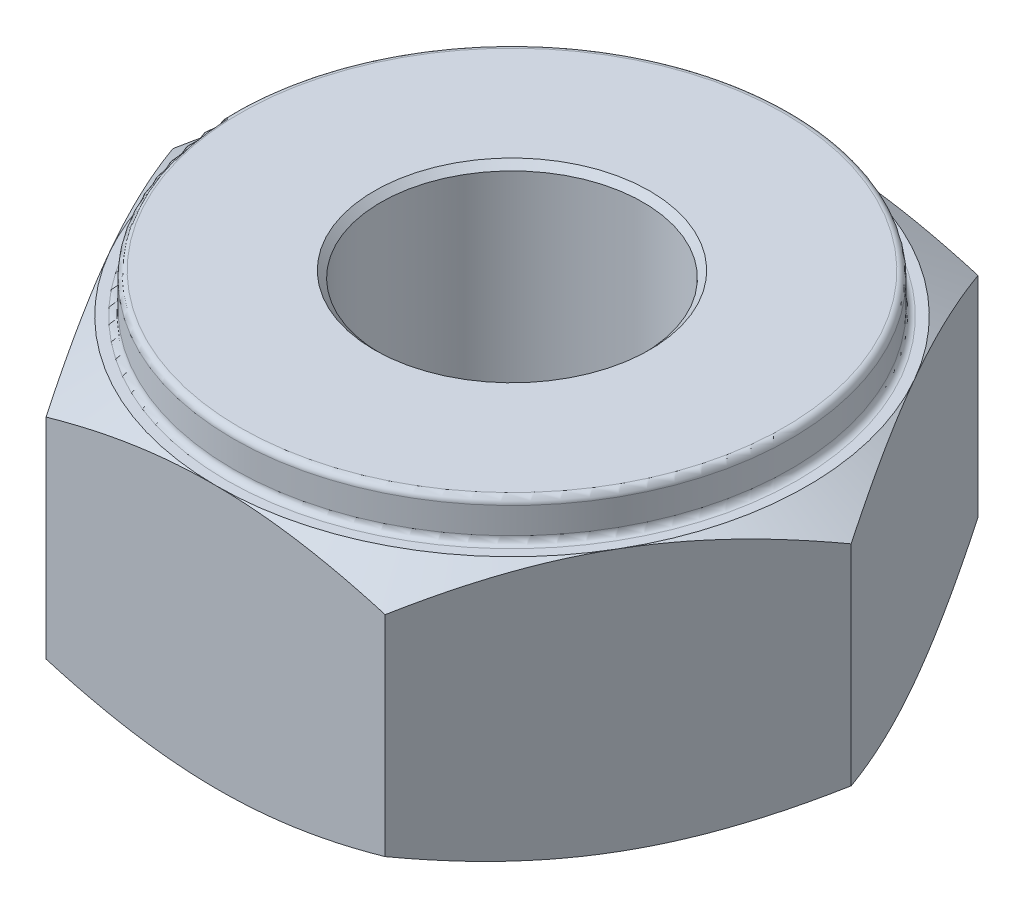
ISO-10303-21;
HEADER;
FILE_DESCRIPTION(('STEP AP214'),'2;1');
FILE_NAME('part.step','',(''),(''),'','','');
FILE_SCHEMA(('AUTOMOTIVE_DESIGN { 1 0 10303 214 1 1 1 1 }'));
ENDSEC;
DATA;
#1=APPLICATION_CONTEXT('core data for automotive mechanical design processes');
#2=APPLICATION_PROTOCOL_DEFINITION('international standard','automotive_design',2000,#1);
#3=PRODUCT_CONTEXT('',#1,'mechanical');
#4=PRODUCT('Part','Part','',(#3));
#5=PRODUCT_RELATED_PRODUCT_CATEGORY('part','',(#4));
#6=PRODUCT_DEFINITION_FORMATION('','',#4);
#7=PRODUCT_DEFINITION_CONTEXT('part definition',#1,'design');
#8=PRODUCT_DEFINITION('design','',#6,#7);
#9=PRODUCT_DEFINITION_SHAPE('','',#8);
#10=(LENGTH_UNIT() NAMED_UNIT(*) SI_UNIT(.MILLI.,.METRE.));
#11=(NAMED_UNIT(*) PLANE_ANGLE_UNIT() SI_UNIT($,.RADIAN.));
#12=(NAMED_UNIT(*) SI_UNIT($,.STERADIAN.) SOLID_ANGLE_UNIT());
#13=UNCERTAINTY_MEASURE_WITH_UNIT(LENGTH_MEASURE(1.E-05),#10,'distance_accuracy_value','');
#14=(GEOMETRIC_REPRESENTATION_CONTEXT(3) GLOBAL_UNCERTAINTY_ASSIGNED_CONTEXT((#13)) GLOBAL_UNIT_ASSIGNED_CONTEXT((#10,
#11,#12)) REPRESENTATION_CONTEXT('',''));
#15=CARTESIAN_POINT('',(0.,0.,0.));
#16=DIRECTION('',(0.,0.,1.));
#17=DIRECTION('',(1.,0.,0.));
#18=AXIS2_PLACEMENT_3D('',#15,#16,#17);
#19=CARTESIAN_POINT('',(0.,2.,0.));
#20=DIRECTION('',(0.,1.,0.));
#21=DIRECTION('',(0.,0.,1.));
#22=AXIS2_PLACEMENT_3D('',#19,#20,#21);
#23=PLANE('',#22);
#24=CARTESIAN_POINT('',(0.,2.,0.));
#25=DIRECTION('',(0.,1.,0.));
#26=DIRECTION('',(0.,0.,1.));
#27=AXIS2_PLACEMENT_3D('',#24,#25,#26);
#28=CIRCLE('',#27,2.175);
#29=CARTESIAN_POINT('',(0.,2.,2.175));
#30=VERTEX_POINT('',#29);
#31=EDGE_CURVE('E359',#30,#30,#28,.F.);
#32=ORIENTED_EDGE('',*,*,#31,.T.);
#33=EDGE_LOOP('',(#32));
#34=FACE_BOUND('',#33,.T.);
#35=CARTESIAN_POINT('',(0.,2.,0.));
#36=DIRECTION('',(0.,1.,0.));
#37=DIRECTION('',(0.,0.,1.));
#38=AXIS2_PLACEMENT_3D('',#35,#36,#37);
#39=CIRCLE('',#38,2.25);
#40=CARTESIAN_POINT('',(-0.0102695018015279,2.,2.24997656372966));
#41=VERTEX_POINT('',#40);
#42=CARTESIAN_POINT('',(1.94340211120874,2.,1.13388193130917));
#43=VERTEX_POINT('',#42);
#44=EDGE_CURVE('E274',#41,#43,#39,.T.);
#45=ORIENTED_EDGE('',*,*,#44,.T.);
#46=CARTESIAN_POINT('',(1.95367161301027,2.,-1.1160946324205));
#47=VERTEX_POINT('',#46);
#48=EDGE_CURVE('E271',#43,#47,#39,.T.);
#49=ORIENTED_EDGE('',*,*,#48,.T.);
#50=CARTESIAN_POINT('',(0.0102695018015286,2.,-2.24997656372966));
#51=VERTEX_POINT('',#50);
#52=EDGE_CURVE('E273',#47,#51,#39,.T.);
#53=ORIENTED_EDGE('',*,*,#52,.T.);
#54=CARTESIAN_POINT('',(-1.94340211120874,2.,-1.13388193130917));
#55=VERTEX_POINT('',#54);
#56=EDGE_CURVE('E280',#51,#55,#39,.T.);
#57=ORIENTED_EDGE('',*,*,#56,.T.);
#58=CARTESIAN_POINT('',(-1.95367161301027,2.,1.1160946324205));
#59=VERTEX_POINT('',#58);
#60=EDGE_CURVE('E283',#55,#59,#39,.T.);
#61=ORIENTED_EDGE('',*,*,#60,.T.);
#62=EDGE_CURVE('E281',#59,#41,#39,.T.);
#63=ORIENTED_EDGE('',*,*,#62,.T.);
#64=EDGE_LOOP('',(#45,#49,#53,#57,#61,#63));
#65=FACE_BOUND('',#64,.T.);
#66=ADVANCED_FACE('F37',(#34,#65),#23,.T.);
#67=CARTESIAN_POINT('',(2.59804914947934,2.,0.0118581992591109));
#68=DIRECTION('',(-0.868298494671231,0.,0.496042058853555));
#69=DIRECTION('',(0.496042058853555,0.,0.868298494671231));
#70=AXIS2_PLACEMENT_3D('',#67,#68,#69);
#71=PLANE('',#70);
#72=CARTESIAN_POINT('',(1.30917982042722,0.20102839088648,-2.24424746410011));
#73=CARTESIAN_POINT('',(1.36581472914689,0.168055417834473,-2.14511069714775));
#74=CARTESIAN_POINT('',(1.42293850533422,0.138067390427814,-2.04511819048808));
#75=CARTESIAN_POINT('',(1.53817527485081,0.0857222748438312,-1.84340159868681));
#76=CARTESIAN_POINT('',(1.59629031621226,0.0633837056746937,-1.74167392856034));
#77=CARTESIAN_POINT('',(1.71180015045161,0.0286094929748457,-1.53947934969427));
#78=CARTESIAN_POINT('',(1.76917716778779,0.0159424252117376,-1.4390435562116));
#79=CARTESIAN_POINT('',(1.88420126606449,0.00081888986870265,-1.23769923549936));
#80=CARTESIAN_POINT('',(1.94184792875088,-0.00165009951489496,-1.13679144040413));
#81=CARTESIAN_POINT('',(2.04956959330919,0.00347839582361984,-0.948229689419473));
#82=CARTESIAN_POINT('',(2.09966069727327,0.00981665861033102,-0.860547547568534));
#83=CARTESIAN_POINT('',(2.19951655238661,0.0299076734212001,-0.685754529251871));
#84=CARTESIAN_POINT('',(2.24928095799439,0.0436672926596137,-0.598644257640402));
#85=CARTESIAN_POINT('',(2.34934280005383,0.078066237054264,-0.423490668779322));
#86=CARTESIAN_POINT('',(2.39962756808215,0.0988514199300298,-0.33546952701405));
#87=CARTESIAN_POINT('',(2.49944699453968,0.146025980122849,-0.160740275360803));
#88=CARTESIAN_POINT('',(2.5489829324192,0.172404268587,-0.0740299258547101));
#89=CARTESIAN_POINT('',(2.59816340559331,0.201028390886479,0.0120581992591108));
#90=B_SPLINE_CURVE_WITH_KNOTS('',3,(#72,#73,#74,#75,#76,#77,#78,#79,#80,#81,#82,#83,#84,#85,#86,
#87,#88,#89),.UNSPECIFIED.,.F.,.F.,(4,2,2,2,2,2,2,2,4),(0.,0.356658784617582,0.714175019292587,
1.0628422966746,1.41108133225846,1.71433351948959,2.01786679812314,2.32813413556889,
2.63779199662167),.UNSPECIFIED.);
#91=CARTESIAN_POINT('',(1.3092940765412,0.20096189432334,-2.24404746410011));
#92=VERTEX_POINT('',#91);
#93=CARTESIAN_POINT('',(1.95367161301027,0.,-1.1160946324205));
#94=VERTEX_POINT('',#93);
#95=EDGE_CURVE('E53',#92,#94,#90,.T.);
#96=ORIENTED_EDGE('',*,*,#95,.F.);
#97=DIRECTION('',(0.,-1.,0.));
#98=VECTOR('',#97,1.);
#99=CARTESIAN_POINT('',(1.3092940765412,2.,-2.24404746410011));
#100=LINE('',#99,#98);
#101=CARTESIAN_POINT('',(1.3092940765412,1.79903810567666,-2.24404746410011));
#102=VERTEX_POINT('',#101);
#103=EDGE_CURVE('E171',#102,#92,#100,.T.);
#104=ORIENTED_EDGE('',*,*,#103,.F.);
#105=CARTESIAN_POINT('',(2.59816340559331,1.79897160911352,0.0120581992591109));
#106=CARTESIAN_POINT('',(2.54152849687364,1.83194458216553,-0.0870785676932454));
#107=CARTESIAN_POINT('',(2.48440472068632,1.86193260957219,-0.187071074352914));
#108=CARTESIAN_POINT('',(2.36916795116973,1.91427772515617,-0.388787666154192));
#109=CARTESIAN_POINT('',(2.31105290980828,1.93661629432531,-0.49051533628066));
#110=CARTESIAN_POINT('',(2.19554307556893,1.97139050702515,-0.692709915146728));
#111=CARTESIAN_POINT('',(2.13816605823275,1.98405757478826,-0.793145708629393));
#112=CARTESIAN_POINT('',(2.02314195995605,1.9991811101313,-0.994490029341633));
#113=CARTESIAN_POINT('',(1.96549529726966,2.00165009951489,-1.09539782443687));
#114=CARTESIAN_POINT('',(1.85777363271135,1.99652160417638,-1.28395957542152));
#115=CARTESIAN_POINT('',(1.80768252874727,1.99018334138967,-1.37164171727246));
#116=CARTESIAN_POINT('',(1.70782667363393,1.9700923265788,-1.54643473558913));
#117=CARTESIAN_POINT('',(1.65806226802615,1.95633270734039,-1.6335450072006));
#118=CARTESIAN_POINT('',(1.55800042596671,1.92193376294574,-1.80869859606168));
#119=CARTESIAN_POINT('',(1.50771565793839,1.90114858006997,-1.89671973782695));
#120=CARTESIAN_POINT('',(1.40789623148086,1.85397401987715,-2.07144898948019));
#121=CARTESIAN_POINT('',(1.35836029360134,1.827595731413,-2.15815933898629));
#122=CARTESIAN_POINT('',(1.30917982042722,1.79897160911352,-2.24424746410011));
#123=B_SPLINE_CURVE_WITH_KNOTS('',3,(#105,#106,#107,#108,#109,#110,#111,#112,#113,#114,#115,
#116,#117,#118,#119,#120,#121,#122),.UNSPECIFIED.,.F.,.F.,(4,2,2,2,2,2,2,2,4),(0.,
0.356658784617582,0.714175019292587,1.0628422966746,1.41108133225846,1.71433351948959,
2.01786679812314,2.32813413556889,2.63779199662167),.UNSPECIFIED.);
#124=EDGE_CURVE('E234',#47,#102,#123,.T.);
#125=ORIENTED_EDGE('',*,*,#124,.F.);
#126=CARTESIAN_POINT('',(2.59804914947934,1.79903810567666,0.011858199259111));
#127=VERTEX_POINT('',#126);
#128=EDGE_CURVE('E162',#127,#47,#123,.T.);
#129=ORIENTED_EDGE('',*,*,#128,.F.);
#130=DIRECTION('',(0.,-1.,0.));
#131=VECTOR('',#130,1.);
#132=CARTESIAN_POINT('',(2.59804914947934,2.,0.0118581992591109));
#133=LINE('',#132,#131);
#134=CARTESIAN_POINT('',(2.59804914947934,0.200961894323341,0.0118581992591111));
#135=VERTEX_POINT('',#134);
#136=EDGE_CURVE('E157',#127,#135,#133,.T.);
#137=ORIENTED_EDGE('',*,*,#136,.T.);
#138=EDGE_CURVE('E150',#94,#135,#90,.T.);
#139=ORIENTED_EDGE('',*,*,#138,.F.);
#140=EDGE_LOOP('',(#96,#104,#125,#129,#137,#139));
#141=FACE_BOUND('',#140,.T.);
#142=ADVANCED_FACE('F244',(#141),#71,.F.);
#143=CARTESIAN_POINT('',(1.3092940765412,2.,-2.24404746410011));
#144=DIRECTION('',(-0.00456422302290162,0.,0.999989583879851));
#145=DIRECTION('',(0.999989583879851,0.,0.00456422302290162));
#146=AXIS2_PLACEMENT_3D('',#143,#144,#145);
#147=PLANE('',#146);
#148=CARTESIAN_POINT('',(-1.28895507293814,0.201019633284916,-2.25590657621333));
#149=CARTESIAN_POINT('',(-1.17478317189917,0.168047379440775,-2.25538546476608));
#150=CARTESIAN_POINT('',(-1.05962574808642,0.138060115957911,-2.25485985512625));
#151=CARTESIAN_POINT('',(-0.827316751578002,0.0857165858965446,-2.25379953401152));
#152=CARTESIAN_POINT('',(-0.710161050506616,0.0633788373293017,-2.25326480369361));
#153=CARTESIAN_POINT('',(-0.47730160159931,0.0286062469010854,-2.25220197016521));
#154=CARTESIAN_POINT('',(-0.361633685881878,0.0159399857570175,-2.2516740305022));
#155=CARTESIAN_POINT('',(-0.129753485924218,0.000818009466727405,-2.25061566653095));
#156=CARTESIAN_POINT('',(-0.0135420447317618,-0.00165022682335794,-2.25008524607061));
#157=CARTESIAN_POINT('',(0.203612927311023,0.00347945892697005,-2.2490940920237));
#158=CARTESIAN_POINT('',(0.304588934757254,0.00981786757956313,-2.24863321020515));
#159=CARTESIAN_POINT('',(0.505883079061653,0.0299084878077692,-2.24771444926741));
#160=CARTESIAN_POINT('',(0.606200519473722,0.043667565029289,-2.247256573327));
#161=CARTESIAN_POINT('',(0.807909829108304,0.0780648173311825,-2.24633591746237));
#162=CARTESIAN_POINT('',(0.909276163558589,0.0988488283532073,-2.24587325408576));
#163=CARTESIAN_POINT('',(1.11049681463058,0.146020599551525,-2.24495482859103));
#164=CARTESIAN_POINT('',(1.21035370999376,0.172397273087838,-2.24449905470282));
#165=CARTESIAN_POINT('',(1.3094940765412,0.201019633284915,-2.244046551246));
#166=B_SPLINE_CURVE_WITH_KNOTS('',3,(#148,#149,#150,#151,#152,#153,#154,#155,#156,#157,#158,
#159,#160,#161,#162,#163,#164,#165),.UNSPECIFIED.,.F.,.F.,(4,2,2,2,2,2,2,2,4),(0.,
0.356656707502105,0.714170808179939,1.0628362069092,1.41107338650957,1.71431215021091,
2.01783195468842,2.32808510484489,2.63772887925734),.UNSPECIFIED.);
#167=CARTESIAN_POINT('',(-1.28875507293814,0.200961894323341,-2.25590566335922));
#168=VERTEX_POINT('',#167);
#169=CARTESIAN_POINT('',(0.0102695018015286,0.,-2.24997656372966));
#170=VERTEX_POINT('',#169);
#171=EDGE_CURVE('E61',#168,#170,#166,.T.);
#172=ORIENTED_EDGE('',*,*,#171,.F.);
#173=DIRECTION('',(0.,-1.,0.));
#174=VECTOR('',#173,1.);
#175=CARTESIAN_POINT('',(-1.28875507293814,2.,-2.25590566335922));
#176=LINE('',#175,#174);
#177=CARTESIAN_POINT('',(-1.28875507293814,1.79903810567666,-2.25590566335922));
#178=VERTEX_POINT('',#177);
#179=EDGE_CURVE('E168',#178,#168,#176,.T.);
#180=ORIENTED_EDGE('',*,*,#179,.F.);
#181=CARTESIAN_POINT('',(1.3094940765412,1.79898036671508,-2.244046551246));
#182=CARTESIAN_POINT('',(1.19532217550223,1.83195262055923,-2.24456766269325));
#183=CARTESIAN_POINT('',(1.08016475168948,1.86193988404209,-2.24509327233308));
#184=CARTESIAN_POINT('',(0.847855755181058,1.91428341410346,-2.24615359344781));
#185=CARTESIAN_POINT('',(0.730700054109672,1.9366211626707,-2.24668832376571));
#186=CARTESIAN_POINT('',(0.497840605202366,1.97139375309891,-2.24775115729412));
#187=CARTESIAN_POINT('',(0.382172689484934,1.98406001424298,-2.24827909695713));
#188=CARTESIAN_POINT('',(0.150292489527274,1.99918199053327,-2.24933746092838));
#189=CARTESIAN_POINT('',(0.0340810483348177,2.00165022682336,-2.24986788138872));
#190=CARTESIAN_POINT('',(-0.183073923707967,1.99652054107303,-2.25085903543563));
#191=CARTESIAN_POINT('',(-0.284049931154198,1.99018213242044,-2.25131991725418));
#192=CARTESIAN_POINT('',(-0.485344075458597,1.97009151219223,-2.25223867819191));
#193=CARTESIAN_POINT('',(-0.585661515870666,1.95633243497071,-2.25269655413233));
#194=CARTESIAN_POINT('',(-0.787370825505248,1.92193518266882,-2.25361720999696));
#195=CARTESIAN_POINT('',(-0.888737159955532,1.90115117164679,-2.25407987337356));
#196=CARTESIAN_POINT('',(-1.08995781102752,1.85397940044847,-2.2549982988683));
#197=CARTESIAN_POINT('',(-1.18981470639071,1.82760272691216,-2.25545407275651));
#198=CARTESIAN_POINT('',(-1.28895507293814,1.79898036671508,-2.25590657621333));
#199=B_SPLINE_CURVE_WITH_KNOTS('',3,(#181,#182,#183,#184,#185,#186,#187,#188,#189,#190,#191,
#192,#193,#194,#195,#196,#197,#198),.UNSPECIFIED.,.F.,.F.,(4,2,2,2,2,2,2,2,4),(0.,
0.356656707502105,0.714170808179939,1.0628362069092,1.41107338650957,1.71431215021091,
2.01783195468842,2.32808510484489,2.63772887925734),.UNSPECIFIED.);
#200=EDGE_CURVE('E226',#51,#178,#199,.T.);
#201=ORIENTED_EDGE('',*,*,#200,.F.);
#202=EDGE_CURVE('E232',#102,#51,#199,.T.);
#203=ORIENTED_EDGE('',*,*,#202,.F.);
#204=ORIENTED_EDGE('',*,*,#103,.T.);
#205=EDGE_CURVE('E251',#170,#92,#166,.T.);
#206=ORIENTED_EDGE('',*,*,#205,.F.);
#207=EDGE_LOOP('',(#172,#180,#201,#203,#204,#206));
#208=FACE_BOUND('',#207,.T.);
#209=ADVANCED_FACE('F240',(#208),#147,.F.);
#210=CARTESIAN_POINT('',(-1.28875507293814,2.,-2.25590566335922));
#211=DIRECTION('',(0.86373427164833,0.,0.503947525026296));
#212=DIRECTION('',(0.503947525026296,0.,-0.86373427164833));
#213=AXIS2_PLACEMENT_3D('',#210,#211,#212);
#214=PLANE('',#213);
#215=CARTESIAN_POINT('',(-2.59816583988785,0.201028742297138,-0.0116581992591103));
#216=CARTESIAN_POINT('',(-2.54062832526532,0.168055740386244,-0.110273870171185));
#217=CARTESIAN_POINT('',(-2.48259415198463,0.138067682326434,-0.209740782696849));
#218=CARTESIAN_POINT('',(-2.36552082201615,0.0857225031218546,-0.41039708591908));
#219=CARTESIAN_POINT('',(-2.30647958464986,0.0633839010252724,-0.511590042767366));
#220=CARTESIAN_POINT('',(-2.18912883751753,0.0286096232301617,-0.71272182151048));
#221=CARTESIAN_POINT('',(-2.13083738662919,0.0159425231006425,-0.812629691627984));
#222=CARTESIAN_POINT('',(-2.01398011595246,0.000818925198947982,-1.01291568285199));
#223=CARTESIAN_POINT('',(-1.9554147210865,-0.00165009440337393,-1.11329307566825));
#224=CARTESIAN_POINT('',(-1.84597618315941,0.00347835316746202,-1.30086382689237));
#225=CARTESIAN_POINT('',(-1.79508668170493,0.00981661010035296,-1.38808522255463));
#226=CARTESIAN_POINT('',(-1.69363923345556,0.029907640743303,-1.56195975010524));
#227=CARTESIAN_POINT('',(-1.64308163771199,0.0436672817305546,-1.64861228031378));
#228=CARTESIAN_POINT('',(-1.54142491783611,0.0780662940223709,-1.82284548623254));
#229=CARTESIAN_POINT('',(-1.49033866410524,0.0988515239203699,-1.91040410288647));
#230=CARTESIAN_POINT('',(-1.38892822395896,0.146026196025483,-2.08421520088267));
#231=CARTESIAN_POINT('',(-1.3386027376914,0.172404549290892,-2.17046991008952));
#232=CARTESIAN_POINT('',(-1.28863838252963,0.201028742297138,-2.25610566335922));
#233=B_SPLINE_CURVE_WITH_KNOTS('',3,(#215,#216,#217,#218,#219,#220,#221,#222,#223,#224,#225,
#226,#227,#228,#229,#230,#231,#232),.UNSPECIFIED.,.F.,.F.,(4,2,2,2,2,2,2,2,4),(0.,
0.356658867964616,0.714175188269108,1.06284254103462,1.41108165109235,1.7143343769552,
2.01786819625201,2.32813610297707,2.63779452927031),.UNSPECIFIED.);
#234=CARTESIAN_POINT('',(-2.59804914947934,0.200961894323341,-0.0118581992591103));
#235=VERTEX_POINT('',#234);
#236=CARTESIAN_POINT('',(-1.94340211120874,0.,-1.13388193130917));
#237=VERTEX_POINT('',#236);
#238=EDGE_CURVE('E269',#235,#237,#233,.T.);
#239=ORIENTED_EDGE('',*,*,#238,.F.);
#240=DIRECTION('',(0.,-1.,0.));
#241=VECTOR('',#240,1.);
#242=CARTESIAN_POINT('',(-2.59804914947934,2.,-0.0118581992591103));
#243=LINE('',#242,#241);
#244=CARTESIAN_POINT('',(-2.59804914947934,1.79903810567666,-0.0118581992591103));
#245=VERTEX_POINT('',#244);
#246=EDGE_CURVE('E159',#245,#235,#243,.T.);
#247=ORIENTED_EDGE('',*,*,#246,.F.);
#248=CARTESIAN_POINT('',(-1.28863838252963,1.79897125770286,-2.25610566335922));
#249=CARTESIAN_POINT('',(-1.34617589715216,1.83194425961376,-2.15748999244715));
#250=CARTESIAN_POINT('',(-1.40421007043286,1.86193231767357,-2.05802307992148));
#251=CARTESIAN_POINT('',(-1.52128340040134,1.91427749687815,-1.85736677669925));
#252=CARTESIAN_POINT('',(-1.58032463776763,1.93661609897473,-1.75617381985096));
#253=CARTESIAN_POINT('',(-1.69767538489995,1.97139037676984,-1.55504204110785));
#254=CARTESIAN_POINT('',(-1.75596683578829,1.98405747689936,-1.45513417099035));
#255=CARTESIAN_POINT('',(-1.87282410646502,1.99918107480105,-1.25484817976634));
#256=CARTESIAN_POINT('',(-1.93138950133098,2.00165009440337,-1.15447078695008));
#257=CARTESIAN_POINT('',(-2.04082803925808,1.99652164683254,-0.966900035725958));
#258=CARTESIAN_POINT('',(-2.09171754071256,1.99018338989965,-0.879678640063704));
#259=CARTESIAN_POINT('',(-2.19316498896193,1.9700923592567,-0.705804112513091));
#260=CARTESIAN_POINT('',(-2.2437225847055,1.95633271826945,-0.619151582304545));
#261=CARTESIAN_POINT('',(-2.34537930458138,1.92193370597763,-0.444918376385788));
#262=CARTESIAN_POINT('',(-2.39646555831225,1.90114847607963,-0.357359759731857));
#263=CARTESIAN_POINT('',(-2.49787599845853,1.85397380397452,-0.183548661735665));
#264=CARTESIAN_POINT('',(-2.54820148472609,1.82759545070911,-0.0972939525288117));
#265=CARTESIAN_POINT('',(-2.59816583988785,1.79897125770286,-0.0116581992591099));
#266=B_SPLINE_CURVE_WITH_KNOTS('',3,(#248,#249,#250,#251,#252,#253,#254,#255,#256,#257,#258,
#259,#260,#261,#262,#263,#264,#265),.UNSPECIFIED.,.F.,.F.,(4,2,2,2,2,2,2,2,4),(0.,
0.356658867964615,0.714175188269108,1.06284254103462,1.41108165109235,1.7143343769552,
2.01786819625201,2.32813610297707,2.63779452927031),.UNSPECIFIED.);
#267=EDGE_CURVE('E219',#55,#245,#266,.T.);
#268=ORIENTED_EDGE('',*,*,#267,.F.);
#269=EDGE_CURVE('E233',#178,#55,#266,.T.);
#270=ORIENTED_EDGE('',*,*,#269,.F.);
#271=ORIENTED_EDGE('',*,*,#179,.T.);
#272=EDGE_CURVE('E264',#237,#168,#233,.T.);
#273=ORIENTED_EDGE('',*,*,#272,.F.);
#274=EDGE_LOOP('',(#239,#247,#268,#270,#271,#273));
#275=FACE_BOUND('',#274,.T.);
#276=ADVANCED_FACE('F243',(#275),#214,.F.);
#277=CARTESIAN_POINT('',(-2.59804914947934,2.,-0.0118581992591103));
#278=DIRECTION('',(0.868298494671231,0.,-0.496042058853555));
#279=DIRECTION('',(-0.496042058853555,0.,-0.868298494671231));
#280=AXIS2_PLACEMENT_3D('',#277,#278,#279);
#281=PLANE('',#280);
#282=CARTESIAN_POINT('',(-1.30917982042722,0.20102839088648,2.24424746410011));
#283=CARTESIAN_POINT('',(-1.36581472914689,0.168055417834473,2.14511069714775));
#284=CARTESIAN_POINT('',(-1.42293850533422,0.138067390427814,2.04511819048808));
#285=CARTESIAN_POINT('',(-1.53817527485081,0.0857222748438315,1.84340159868681));
#286=CARTESIAN_POINT('',(-1.59629031621226,0.0633837056746939,1.74167392856034));
#287=CARTESIAN_POINT('',(-1.71180015045161,0.0286094929748459,1.53947934969427));
#288=CARTESIAN_POINT('',(-1.76917716778779,0.0159424252117377,1.4390435562116));
#289=CARTESIAN_POINT('',(-1.88420126606449,0.000818889868702882,1.23769923549936));
#290=CARTESIAN_POINT('',(-1.94184792875088,-0.00165009951489457,1.13679144040413));
#291=CARTESIAN_POINT('',(-2.04956959330919,0.00347839582362032,0.948229689419473));
#292=CARTESIAN_POINT('',(-2.09966069727327,0.00981665861033146,0.860547547568534));
#293=CARTESIAN_POINT('',(-2.19951655238661,0.0299076734212005,0.685754529251871));
#294=CARTESIAN_POINT('',(-2.24928095799439,0.0436672926596142,0.598644257640402));
#295=CARTESIAN_POINT('',(-2.34934280005383,0.0780662370542645,0.423490668779322));
#296=CARTESIAN_POINT('',(-2.39962756808215,0.0988514199300302,0.335469527014051));
#297=CARTESIAN_POINT('',(-2.49944699453968,0.146025980122849,0.160740275360803));
#298=CARTESIAN_POINT('',(-2.5489829324192,0.172404268587001,0.0740299258547107));
#299=CARTESIAN_POINT('',(-2.59816340559332,0.20102839088648,-0.0120581992591102));
#300=B_SPLINE_CURVE_WITH_KNOTS('',3,(#282,#283,#284,#285,#286,#287,#288,#289,#290,#291,#292,
#293,#294,#295,#296,#297,#298,#299),.UNSPECIFIED.,.F.,.F.,(4,2,2,2,2,2,2,2,4),(0.,
0.356658784617582,0.714175019292587,1.0628422966746,1.41108133225846,1.71433351948959,
2.01786679812314,2.32813413556889,2.63779199662166),.UNSPECIFIED.);
#301=CARTESIAN_POINT('',(-1.3092940765412,0.200961894323341,2.24404746410011));
#302=VERTEX_POINT('',#301);
#303=CARTESIAN_POINT('',(-1.95367161301027,0.,1.1160946324205));
#304=VERTEX_POINT('',#303);
#305=EDGE_CURVE('E258',#302,#304,#300,.T.);
#306=ORIENTED_EDGE('',*,*,#305,.F.);
#307=DIRECTION('',(0.,-1.,0.));
#308=VECTOR('',#307,1.);
#309=CARTESIAN_POINT('',(-1.3092940765412,2.,2.24404746410011));
#310=LINE('',#309,#308);
#311=CARTESIAN_POINT('',(-1.3092940765412,1.79903810567666,2.24404746410011));
#312=VERTEX_POINT('',#311);
#313=EDGE_CURVE('E156',#312,#302,#310,.T.);
#314=ORIENTED_EDGE('',*,*,#313,.F.);
#315=CARTESIAN_POINT('',(-2.59816340559332,1.79897160911352,-0.0120581992591103));
#316=CARTESIAN_POINT('',(-2.54152849687365,1.83194458216553,0.0870785676932461));
#317=CARTESIAN_POINT('',(-2.48440472068632,1.86193260957219,0.187071074352915));
#318=CARTESIAN_POINT('',(-2.36916795116973,1.91427772515617,0.388787666154192));
#319=CARTESIAN_POINT('',(-2.31105290980828,1.93661629432531,0.49051533628066));
#320=CARTESIAN_POINT('',(-2.19554307556893,1.97139050702515,0.692709915146729));
#321=CARTESIAN_POINT('',(-2.13816605823275,1.98405757478826,0.793145708629393));
#322=CARTESIAN_POINT('',(-2.02314195995605,1.9991811101313,0.994490029341633));
#323=CARTESIAN_POINT('',(-1.96549529726966,2.00165009951489,1.09539782443687));
#324=CARTESIAN_POINT('',(-1.85777363271135,1.99652160417638,1.28395957542152));
#325=CARTESIAN_POINT('',(-1.80768252874727,1.99018334138967,1.37164171727246));
#326=CARTESIAN_POINT('',(-1.70782667363393,1.9700923265788,1.54643473558913));
#327=CARTESIAN_POINT('',(-1.65806226802615,1.95633270734039,1.6335450072006));
#328=CARTESIAN_POINT('',(-1.55800042596671,1.92193376294574,1.80869859606168));
#329=CARTESIAN_POINT('',(-1.50771565793839,1.90114858006997,1.89671973782695));
#330=CARTESIAN_POINT('',(-1.40789623148086,1.85397401987715,2.07144898948019));
#331=CARTESIAN_POINT('',(-1.35836029360134,1.827595731413,2.15815933898629));
#332=CARTESIAN_POINT('',(-1.30917982042722,1.79897160911352,2.24424746410011));
#333=B_SPLINE_CURVE_WITH_KNOTS('',3,(#315,#316,#317,#318,#319,#320,#321,#322,#323,#324,#325,
#326,#327,#328,#329,#330,#331,#332),.UNSPECIFIED.,.F.,.F.,(4,2,2,2,2,2,2,2,4),(0.,
0.356658784617582,0.714175019292587,1.0628422966746,1.41108133225846,1.71433351948959,
2.01786679812314,2.32813413556889,2.63779199662167),.UNSPECIFIED.);
#334=EDGE_CURVE('E212',#59,#312,#333,.T.);
#335=ORIENTED_EDGE('',*,*,#334,.F.);
#336=EDGE_CURVE('E411',#245,#59,#333,.T.);
#337=ORIENTED_EDGE('',*,*,#336,.F.);
#338=ORIENTED_EDGE('',*,*,#246,.T.);
#339=EDGE_CURVE('E270',#304,#235,#300,.T.);
#340=ORIENTED_EDGE('',*,*,#339,.F.);
#341=EDGE_LOOP('',(#306,#314,#335,#337,#338,#340));
#342=FACE_BOUND('',#341,.T.);
#343=ADVANCED_FACE('F326',(#342),#281,.F.);
#344=CARTESIAN_POINT('',(-1.3092940765412,2.,2.24404746410011));
#345=DIRECTION('',(0.00456422302290129,0.,-0.999989583879851));
#346=DIRECTION('',(-0.999989583879851,0.,-0.00456422302290129));
#347=AXIS2_PLACEMENT_3D('',#344,#345,#346);
#348=PLANE('',#347);
#349=CARTESIAN_POINT('',(1.28895507293814,0.201019633284915,2.25590657621333));
#350=CARTESIAN_POINT('',(1.17478317189917,0.168047379440775,2.25538546476608));
#351=CARTESIAN_POINT('',(1.05962574808642,0.13806011595791,2.25485985512624));
#352=CARTESIAN_POINT('',(0.827316751578002,0.0857165858965441,2.25379953401152));
#353=CARTESIAN_POINT('',(0.710161050506616,0.0633788373293011,2.25326480369361));
#354=CARTESIAN_POINT('',(0.47730160159931,0.0286062469010848,2.25220197016521));
#355=CARTESIAN_POINT('',(0.361633685881878,0.0159399857570171,2.2516740305022));
#356=CARTESIAN_POINT('',(0.129753485924217,0.000818009466727267,2.25061566653095));
#357=CARTESIAN_POINT('',(0.0135420447317616,-0.00165022682335792,2.25008524607061));
#358=CARTESIAN_POINT('',(-0.203612927311023,0.00347945892697006,2.2490940920237));
#359=CARTESIAN_POINT('',(-0.304588934757254,0.00981786757956301,2.24863321020515));
#360=CARTESIAN_POINT('',(-0.505883079061653,0.0299084878077689,2.24771444926741));
#361=CARTESIAN_POINT('',(-0.606200519473722,0.0436675650292889,2.247256573327));
#362=CARTESIAN_POINT('',(-0.807909829108305,0.0780648173311825,2.24633591746237));
#363=CARTESIAN_POINT('',(-0.909276163558589,0.0988488283532073,2.24587325408576));
#364=CARTESIAN_POINT('',(-1.11049681463058,0.146020599551525,2.24495482859103));
#365=CARTESIAN_POINT('',(-1.21035370999376,0.172397273087838,2.24449905470282));
#366=CARTESIAN_POINT('',(-1.3094940765412,0.201019633284915,2.244046551246));
#367=B_SPLINE_CURVE_WITH_KNOTS('',3,(#349,#350,#351,#352,#353,#354,#355,#356,#357,#358,#359,
#360,#361,#362,#363,#364,#365,#366),.UNSPECIFIED.,.F.,.F.,(4,2,2,2,2,2,2,2,4),(0.,
0.356656707502105,0.714170808179938,1.0628362069092,1.41107338650956,1.71431215021091,
2.01783195468842,2.32808510484489,2.63772887925734),.UNSPECIFIED.);
#368=CARTESIAN_POINT('',(1.28875507293814,0.20096189432334,2.25590566335922));
#369=VERTEX_POINT('',#368);
#370=CARTESIAN_POINT('',(-0.0102695018015279,0.,2.24997656372966));
#371=VERTEX_POINT('',#370);
#372=EDGE_CURVE('E132',#369,#371,#367,.T.);
#373=ORIENTED_EDGE('',*,*,#372,.F.);
#374=DIRECTION('',(0.,-1.,0.));
#375=VECTOR('',#374,1.);
#376=CARTESIAN_POINT('',(1.28875507293814,2.,2.25590566335922));
#377=LINE('',#376,#375);
#378=CARTESIAN_POINT('',(1.28875507293814,1.79903810567666,2.25590566335922));
#379=VERTEX_POINT('',#378);
#380=EDGE_CURVE('E147',#379,#369,#377,.T.);
#381=ORIENTED_EDGE('',*,*,#380,.F.);
#382=CARTESIAN_POINT('',(-1.3094940765412,1.79898036671508,2.244046551246));
#383=CARTESIAN_POINT('',(-1.19532217550223,1.83195262055923,2.24456766269325));
#384=CARTESIAN_POINT('',(-1.08016475168948,1.86193988404209,2.24509327233308));
#385=CARTESIAN_POINT('',(-0.847855755181058,1.91428341410346,2.24615359344781));
#386=CARTESIAN_POINT('',(-0.730700054109672,1.9366211626707,2.24668832376571));
#387=CARTESIAN_POINT('',(-0.497840605202367,1.97139375309891,2.24775115729412));
#388=CARTESIAN_POINT('',(-0.382172689484935,1.98406001424298,2.24827909695713));
#389=CARTESIAN_POINT('',(-0.150292489527274,1.99918199053327,2.24933746092838));
#390=CARTESIAN_POINT('',(-0.0340810483348183,2.00165022682336,2.24986788138872));
#391=CARTESIAN_POINT('',(0.183073923707966,1.99652054107303,2.25085903543563));
#392=CARTESIAN_POINT('',(0.284049931154197,1.99018213242044,2.25131991725418));
#393=CARTESIAN_POINT('',(0.485344075458596,1.97009151219223,2.25223867819191));
#394=CARTESIAN_POINT('',(0.585661515870665,1.95633243497071,2.25269655413233));
#395=CARTESIAN_POINT('',(0.787370825505248,1.92193518266882,2.25361720999696));
#396=CARTESIAN_POINT('',(0.888737159955532,1.90115117164679,2.25407987337356));
#397=CARTESIAN_POINT('',(1.08995781102752,1.85397940044847,2.2549982988683));
#398=CARTESIAN_POINT('',(1.1898147063907,1.82760272691216,2.25545407275651));
#399=CARTESIAN_POINT('',(1.28895507293814,1.79898036671509,2.25590657621333));
#400=B_SPLINE_CURVE_WITH_KNOTS('',3,(#382,#383,#384,#385,#386,#387,#388,#389,#390,#391,#392,
#393,#394,#395,#396,#397,#398,#399),.UNSPECIFIED.,.F.,.F.,(4,2,2,2,2,2,2,2,4),(0.,
0.356656707502105,0.714170808179938,1.0628362069092,1.41107338650956,1.71431215021091,
2.01783195468842,2.32808510484489,2.63772887925734),.UNSPECIFIED.);
#401=EDGE_CURVE('E204',#41,#379,#400,.T.);
#402=ORIENTED_EDGE('',*,*,#401,.F.);
#403=EDGE_CURVE('E279',#312,#41,#400,.T.);
#404=ORIENTED_EDGE('',*,*,#403,.F.);
#405=ORIENTED_EDGE('',*,*,#313,.T.);
#406=EDGE_CURVE('E149',#371,#302,#367,.T.);
#407=ORIENTED_EDGE('',*,*,#406,.F.);
#408=EDGE_LOOP('',(#373,#381,#402,#404,#405,#407));
#409=FACE_BOUND('',#408,.T.);
#410=ADVANCED_FACE('F145',(#409),#348,.F.);
#411=CARTESIAN_POINT('',(1.28875507293814,2.,2.25590566335922));
#412=DIRECTION('',(-0.86373427164833,0.,-0.503947525026296));
#413=DIRECTION('',(-0.503947525026296,0.,0.86373427164833));
#414=AXIS2_PLACEMENT_3D('',#411,#412,#413);
#415=PLANE('',#414);
#416=CARTESIAN_POINT('',(2.59816583988785,0.201028742297138,0.0116581992591109));
#417=CARTESIAN_POINT('',(2.54062832526532,0.168055740386244,0.110273870171185));
#418=CARTESIAN_POINT('',(2.48259415198463,0.138067682326434,0.209740782696849));
#419=CARTESIAN_POINT('',(2.36552082201615,0.0857225031218544,0.410397085919081));
#420=CARTESIAN_POINT('',(2.30647958464986,0.0633839010252723,0.511590042767367));
#421=CARTESIAN_POINT('',(2.18912883751753,0.0286096232301617,0.71272182151048));
#422=CARTESIAN_POINT('',(2.13083738662919,0.0159425231006424,0.812629691627984));
#423=CARTESIAN_POINT('',(2.01398011595246,0.00081892519894771,1.01291568285199));
#424=CARTESIAN_POINT('',(1.9554147210865,-0.00165009440337427,1.11329307566825));
#425=CARTESIAN_POINT('',(1.84597618315941,0.00347835316746184,1.30086382689237));
#426=CARTESIAN_POINT('',(1.79508668170492,0.00981661010035293,1.38808522255463));
#427=CARTESIAN_POINT('',(1.69363923345556,0.0299076407433028,1.56195975010524));
#428=CARTESIAN_POINT('',(1.64308163771199,0.0436672817305541,1.64861228031378));
#429=CARTESIAN_POINT('',(1.54142491783611,0.0780662940223702,1.82284548623254));
#430=CARTESIAN_POINT('',(1.49033866410524,0.0988515239203693,1.91040410288647));
#431=CARTESIAN_POINT('',(1.38892822395896,0.146026196025483,2.08421520088266));
#432=CARTESIAN_POINT('',(1.3386027376914,0.172404549290892,2.17046991008952));
#433=CARTESIAN_POINT('',(1.28863838252963,0.201028742297137,2.25610566335922));
#434=B_SPLINE_CURVE_WITH_KNOTS('',3,(#416,#417,#418,#419,#420,#421,#422,#423,#424,#425,#426,
#427,#428,#429,#430,#431,#432,#433),.UNSPECIFIED.,.F.,.F.,(4,2,2,2,2,2,2,2,4),(0.,
0.356658867964615,0.714175188269108,1.06284254103462,1.41108165109235,1.7143343769552,
2.01786819625201,2.32813610297707,2.63779452927031),.UNSPECIFIED.);
#435=CARTESIAN_POINT('',(1.94340211120874,0.,1.13388193130917));
#436=VERTEX_POINT('',#435);
#437=EDGE_CURVE('E139',#135,#436,#434,.T.);
#438=ORIENTED_EDGE('',*,*,#437,.F.);
#439=ORIENTED_EDGE('',*,*,#136,.F.);
#440=CARTESIAN_POINT('',(1.28863838252963,1.79897125770286,2.25610566335922));
#441=CARTESIAN_POINT('',(1.34617589715216,1.83194425961376,2.15748999244714));
#442=CARTESIAN_POINT('',(1.40421007043286,1.86193231767357,2.05802307992148));
#443=CARTESIAN_POINT('',(1.52128340040134,1.91427749687815,1.85736677669925));
#444=CARTESIAN_POINT('',(1.58032463776762,1.93661609897473,1.75617381985096));
#445=CARTESIAN_POINT('',(1.69767538489995,1.97139037676984,1.55504204110785));
#446=CARTESIAN_POINT('',(1.75596683578829,1.98405747689936,1.45513417099035));
#447=CARTESIAN_POINT('',(1.87282410646502,1.99918107480105,1.25484817976634));
#448=CARTESIAN_POINT('',(1.93138950133098,2.00165009440337,1.15447078695008));
#449=CARTESIAN_POINT('',(2.04082803925808,1.99652164683254,0.966900035725958));
#450=CARTESIAN_POINT('',(2.09171754071256,1.99018338989965,0.879678640063704));
#451=CARTESIAN_POINT('',(2.19316498896193,1.9700923592567,0.705804112513091));
#452=CARTESIAN_POINT('',(2.24372258470549,1.95633271826945,0.619151582304546));
#453=CARTESIAN_POINT('',(2.34537930458138,1.92193370597763,0.444918376385789));
#454=CARTESIAN_POINT('',(2.39646555831225,1.90114847607963,0.357359759731858));
#455=CARTESIAN_POINT('',(2.49787599845853,1.85397380397452,0.183548661735665));
#456=CARTESIAN_POINT('',(2.54820148472609,1.82759545070911,0.0972939525288125));
#457=CARTESIAN_POINT('',(2.59816583988785,1.79897125770286,0.0116581992591107));
#458=B_SPLINE_CURVE_WITH_KNOTS('',3,(#440,#441,#442,#443,#444,#445,#446,#447,#448,#449,#450,
#451,#452,#453,#454,#455,#456,#457),.UNSPECIFIED.,.F.,.F.,(4,2,2,2,2,2,2,2,4),(0.,
0.356658867964615,0.714175188269107,1.06284254103462,1.41108165109235,1.7143343769552,
2.01786819625201,2.32813610297707,2.63779452927031),.UNSPECIFIED.);
#459=EDGE_CURVE('E174',#43,#127,#458,.T.);
#460=ORIENTED_EDGE('',*,*,#459,.F.);
#461=EDGE_CURVE('E155',#379,#43,#458,.T.);
#462=ORIENTED_EDGE('',*,*,#461,.F.);
#463=ORIENTED_EDGE('',*,*,#380,.T.);
#464=EDGE_CURVE('E129',#436,#369,#434,.T.);
#465=ORIENTED_EDGE('',*,*,#464,.F.);
#466=EDGE_LOOP('',(#438,#439,#460,#462,#463,#465));
#467=FACE_BOUND('',#466,.T.);
#468=ADVANCED_FACE('F153',(#467),#415,.F.);
#469=CARTESIAN_POINT('',(0.,0.,0.));
#470=DIRECTION('',(0.,1.,0.));
#471=DIRECTION('',(0.,0.,1.));
#472=AXIS2_PLACEMENT_3D('',#469,#470,#471);
#473=PLANE('',#472);
#474=CARTESIAN_POINT('',(0.,0.,0.));
#475=DIRECTION('',(0.,1.,0.));
#476=DIRECTION('',(0.,0.,1.));
#477=AXIS2_PLACEMENT_3D('',#474,#475,#476);
#478=CIRCLE('',#477,1.05);
#479=CARTESIAN_POINT('',(0.,0.,1.05));
#480=VERTEX_POINT('',#479);
#481=EDGE_CURVE('E351',#480,#480,#478,.T.);
#482=ORIENTED_EDGE('',*,*,#481,.T.);
#483=EDGE_LOOP('',(#482));
#484=FACE_BOUND('',#483,.T.);
#485=CARTESIAN_POINT('',(0.,0.,0.));
#486=DIRECTION('',(0.,1.,0.));
#487=DIRECTION('',(0.,0.,1.));
#488=AXIS2_PLACEMENT_3D('',#485,#486,#487);
#489=CIRCLE('',#488,2.25);
#490=EDGE_CURVE('E300',#436,#94,#489,.T.);
#491=ORIENTED_EDGE('',*,*,#490,.F.);
#492=EDGE_CURVE('E134',#371,#436,#489,.T.);
#493=ORIENTED_EDGE('',*,*,#492,.F.);
#494=EDGE_CURVE('E302',#304,#371,#489,.T.);
#495=ORIENTED_EDGE('',*,*,#494,.F.);
#496=EDGE_CURVE('E288',#237,#304,#489,.T.);
#497=ORIENTED_EDGE('',*,*,#496,.F.);
#498=EDGE_CURVE('E295',#170,#237,#489,.T.);
#499=ORIENTED_EDGE('',*,*,#498,.F.);
#500=CARTESIAN_POINT('',(0.,0.,0.));
#501=DIRECTION('',(0.,-1.,0.));
#502=DIRECTION('',(0.,0.,-1.));
#503=AXIS2_PLACEMENT_3D('',#500,#501,#502);
#504=CIRCLE('',#503,2.25);
#505=EDGE_CURVE('E140',#170,#94,#504,.T.);
#506=ORIENTED_EDGE('',*,*,#505,.T.);
#507=EDGE_LOOP('',(#491,#493,#495,#497,#499,#506));
#508=FACE_BOUND('',#507,.T.);
#509=ADVANCED_FACE('F301',(#484,#508),#473,.F.);
#510=CARTESIAN_POINT('',(0.,2.,0.));
#511=DIRECTION('',(0.,-1.,0.));
#512=DIRECTION('',(0.,0.,-1.));
#513=AXIS2_PLACEMENT_3D('',#510,#511,#512);
#514=CYLINDRICAL_SURFACE('',#513,1.);
#515=CARTESIAN_POINT('',(0.,0.0499999999999988,0.));
#516=DIRECTION('',(0.,1.,0.));
#517=DIRECTION('',(0.,0.,1.));
#518=AXIS2_PLACEMENT_3D('',#515,#516,#517);
#519=CIRCLE('',#518,1.);
#520=CARTESIAN_POINT('',(0.,0.0499999999999988,1.));
#521=VERTEX_POINT('',#520);
#522=EDGE_CURVE('E46',#521,#521,#519,.F.);
#523=ORIENTED_EDGE('',*,*,#522,.T.);
#524=EDGE_LOOP('',(#523));
#525=FACE_BOUND('',#524,.T.);
#526=CARTESIAN_POINT('',(0.,2.25,0.));
#527=DIRECTION('',(0.,1.,0.));
#528=DIRECTION('',(0.,0.,1.));
#529=AXIS2_PLACEMENT_3D('',#526,#527,#528);
#530=CIRCLE('',#529,1.);
#531=CARTESIAN_POINT('',(0.,2.25,1.));
#532=VERTEX_POINT('',#531);
#533=EDGE_CURVE('E353',#532,#532,#530,.T.);
#534=ORIENTED_EDGE('',*,*,#533,.T.);
#535=EDGE_LOOP('',(#534));
#536=FACE_BOUND('',#535,.T.);
#537=ADVANCED_FACE('F192',(#525,#536),#514,.F.);
#538=CARTESIAN_POINT('',(0.,2.,0.));
#539=DIRECTION('',(0.,-1.,0.));
#540=DIRECTION('',(0.,0.,1.));
#541=AXIS2_PLACEMENT_3D('',#538,#539,#540);
#542=CONICAL_SURFACE('',#541,2.25,1.0471975511966);
#543=ORIENTED_EDGE('',*,*,#128,.T.);
#544=ORIENTED_EDGE('',*,*,#48,.F.);
#545=ORIENTED_EDGE('',*,*,#459,.T.);
#546=EDGE_LOOP('',(#543,#544,#545));
#547=FACE_BOUND('',#546,.T.);
#548=ADVANCED_FACE('F186',(#547),#542,.T.);
#549=ORIENTED_EDGE('',*,*,#401,.T.);
#550=ORIENTED_EDGE('',*,*,#461,.T.);
#551=ORIENTED_EDGE('',*,*,#44,.F.);
#552=EDGE_LOOP('',(#549,#550,#551));
#553=FACE_BOUND('',#552,.T.);
#554=ADVANCED_FACE('F191',(#553),#542,.T.);
#555=ORIENTED_EDGE('',*,*,#334,.T.);
#556=ORIENTED_EDGE('',*,*,#403,.T.);
#557=ORIENTED_EDGE('',*,*,#62,.F.);
#558=EDGE_LOOP('',(#555,#556,#557));
#559=FACE_BOUND('',#558,.T.);
#560=ADVANCED_FACE('F407',(#559),#542,.T.);
#561=ORIENTED_EDGE('',*,*,#267,.T.);
#562=ORIENTED_EDGE('',*,*,#336,.T.);
#563=ORIENTED_EDGE('',*,*,#60,.F.);
#564=EDGE_LOOP('',(#561,#562,#563));
#565=FACE_BOUND('',#564,.T.);
#566=ADVANCED_FACE('F412',(#565),#542,.T.);
#567=ORIENTED_EDGE('',*,*,#200,.T.);
#568=ORIENTED_EDGE('',*,*,#269,.T.);
#569=ORIENTED_EDGE('',*,*,#56,.F.);
#570=EDGE_LOOP('',(#567,#568,#569));
#571=FACE_BOUND('',#570,.T.);
#572=ADVANCED_FACE('F415',(#571),#542,.T.);
#573=ORIENTED_EDGE('',*,*,#124,.T.);
#574=ORIENTED_EDGE('',*,*,#202,.T.);
#575=ORIENTED_EDGE('',*,*,#52,.F.);
#576=EDGE_LOOP('',(#573,#574,#575));
#577=FACE_BOUND('',#576,.T.);
#578=ADVANCED_FACE('F194',(#577),#542,.T.);
#579=CARTESIAN_POINT('',(0.,0.,0.));
#580=DIRECTION('',(0.,1.,0.));
#581=DIRECTION('',(0.,0.,-1.));
#582=AXIS2_PLACEMENT_3D('',#579,#580,#581);
#583=CONICAL_SURFACE('',#582,2.25,1.0471975511966);
#584=ORIENTED_EDGE('',*,*,#372,.T.);
#585=ORIENTED_EDGE('',*,*,#492,.T.);
#586=ORIENTED_EDGE('',*,*,#464,.T.);
#587=EDGE_LOOP('',(#584,#585,#586));
#588=FACE_BOUND('',#587,.T.);
#589=ADVANCED_FACE('F131',(#588),#583,.T.);
#590=ORIENTED_EDGE('',*,*,#305,.T.);
#591=ORIENTED_EDGE('',*,*,#494,.T.);
#592=ORIENTED_EDGE('',*,*,#406,.T.);
#593=EDGE_LOOP('',(#590,#591,#592));
#594=FACE_BOUND('',#593,.T.);
#595=ADVANCED_FACE('F426',(#594),#583,.T.);
#596=ORIENTED_EDGE('',*,*,#238,.T.);
#597=ORIENTED_EDGE('',*,*,#496,.T.);
#598=ORIENTED_EDGE('',*,*,#339,.T.);
#599=EDGE_LOOP('',(#596,#597,#598));
#600=FACE_BOUND('',#599,.T.);
#601=ADVANCED_FACE('F195',(#600),#583,.T.);
#602=ORIENTED_EDGE('',*,*,#272,.T.);
#603=ORIENTED_EDGE('',*,*,#171,.T.);
#604=ORIENTED_EDGE('',*,*,#498,.T.);
#605=EDGE_LOOP('',(#602,#603,#604));
#606=FACE_BOUND('',#605,.T.);
#607=ADVANCED_FACE('F296',(#606),#583,.T.);
#608=ORIENTED_EDGE('',*,*,#205,.T.);
#609=ORIENTED_EDGE('',*,*,#95,.T.);
#610=ORIENTED_EDGE('',*,*,#505,.F.);
#611=EDGE_LOOP('',(#608,#609,#610));
#612=FACE_BOUND('',#611,.T.);
#613=ADVANCED_FACE('F425',(#612),#583,.T.);
#614=ORIENTED_EDGE('',*,*,#138,.T.);
#615=ORIENTED_EDGE('',*,*,#437,.T.);
#616=ORIENTED_EDGE('',*,*,#490,.T.);
#617=EDGE_LOOP('',(#614,#615,#616));
#618=FACE_BOUND('',#617,.T.);
#619=ADVANCED_FACE('F423',(#618),#583,.T.);
#620=CARTESIAN_POINT('',(0.,2.3,0.));
#621=DIRECTION('',(0.,1.,0.));
#622=DIRECTION('',(0.,0.,1.));
#623=AXIS2_PLACEMENT_3D('',#620,#621,#622);
#624=PLANE('',#623);
#625=CARTESIAN_POINT('',(0.,2.3,0.));
#626=DIRECTION('',(0.,1.,0.));
#627=DIRECTION('',(0.,0.,1.));
#628=AXIS2_PLACEMENT_3D('',#625,#626,#627);
#629=CIRCLE('',#628,1.05);
#630=CARTESIAN_POINT('',(0.,2.3,1.05));
#631=VERTEX_POINT('',#630);
#632=EDGE_CURVE('E12',#631,#631,#629,.F.);
#633=ORIENTED_EDGE('',*,*,#632,.T.);
#634=EDGE_LOOP('',(#633));
#635=FACE_BOUND('',#634,.T.);
#636=CARTESIAN_POINT('',(0.,2.3,0.));
#637=DIRECTION('',(0.,1.,0.));
#638=DIRECTION('',(0.,0.,1.));
#639=AXIS2_PLACEMENT_3D('',#636,#637,#638);
#640=CIRCLE('',#639,2.075);
#641=CARTESIAN_POINT('',(0.,2.3,2.075));
#642=VERTEX_POINT('',#641);
#643=EDGE_CURVE('E354',#642,#642,#640,.T.);
#644=ORIENTED_EDGE('',*,*,#643,.T.);
#645=EDGE_LOOP('',(#644));
#646=FACE_BOUND('',#645,.T.);
#647=ADVANCED_FACE('F386',(#635,#646),#624,.T.);
#648=CARTESIAN_POINT('',(0.,2.3,0.));
#649=DIRECTION('',(0.,-1.,0.));
#650=DIRECTION('',(0.,0.,-1.));
#651=AXIS2_PLACEMENT_3D('',#648,#649,#650);
#652=CYLINDRICAL_SURFACE('',#651,2.125);
#653=CARTESIAN_POINT('',(0.,2.05,0.));
#654=DIRECTION('',(0.,1.,0.));
#655=DIRECTION('',(0.,0.,1.));
#656=AXIS2_PLACEMENT_3D('',#653,#654,#655);
#657=CIRCLE('',#656,2.125);
#658=CARTESIAN_POINT('',(0.,2.05,2.125));
#659=VERTEX_POINT('',#658);
#660=EDGE_CURVE('E392',#659,#659,#657,.T.);
#661=ORIENTED_EDGE('',*,*,#660,.T.);
#662=EDGE_LOOP('',(#661));
#663=FACE_BOUND('',#662,.T.);
#664=CARTESIAN_POINT('',(0.,2.25,0.));
#665=DIRECTION('',(0.,1.,0.));
#666=DIRECTION('',(0.,0.,1.));
#667=AXIS2_PLACEMENT_3D('',#664,#665,#666);
#668=CIRCLE('',#667,2.125);
#669=CARTESIAN_POINT('',(0.,2.25,2.125));
#670=VERTEX_POINT('',#669);
#671=EDGE_CURVE('E393',#670,#670,#668,.F.);
#672=ORIENTED_EDGE('',*,*,#671,.T.);
#673=EDGE_LOOP('',(#672));
#674=FACE_BOUND('',#673,.T.);
#675=ADVANCED_FACE('F381',(#663,#674),#652,.T.);
#676=CARTESIAN_POINT('',(0.,2.05,0.));
#677=DIRECTION('',(0.,1.,0.));
#678=DIRECTION('',(0.,0.,1.));
#679=AXIS2_PLACEMENT_3D('',#676,#677,#678);
#680=TOROIDAL_SURFACE('',#679,2.175,0.05);
#681=ORIENTED_EDGE('',*,*,#31,.F.);
#682=EDGE_LOOP('',(#681));
#683=FACE_BOUND('',#682,.T.);
#684=ORIENTED_EDGE('',*,*,#660,.F.);
#685=EDGE_LOOP('',(#684));
#686=FACE_BOUND('',#685,.T.);
#687=ADVANCED_FACE('F374',(#683,#686),#680,.F.);
#688=CARTESIAN_POINT('',(0.,2.25,0.));
#689=DIRECTION('',(0.,1.,0.));
#690=DIRECTION('',(0.,0.,1.));
#691=AXIS2_PLACEMENT_3D('',#688,#689,#690);
#692=TOROIDAL_SURFACE('',#691,2.075,0.05);
#693=ORIENTED_EDGE('',*,*,#671,.F.);
#694=EDGE_LOOP('',(#693));
#695=FACE_BOUND('',#694,.T.);
#696=ORIENTED_EDGE('',*,*,#643,.F.);
#697=EDGE_LOOP('',(#696));
#698=FACE_BOUND('',#697,.T.);
#699=ADVANCED_FACE('F368',(#695,#698),#692,.T.);
#700=CARTESIAN_POINT('',(0.,0.,0.));
#701=DIRECTION('',(0.,-1.,0.));
#702=DIRECTION('',(0.,0.,-1.));
#703=AXIS2_PLACEMENT_3D('',#700,#701,#702);
#704=CONICAL_SURFACE('',#703,1.05,0.785398163397448);
#705=ORIENTED_EDGE('',*,*,#522,.F.);
#706=EDGE_LOOP('',(#705));
#707=FACE_BOUND('',#706,.T.);
#708=ORIENTED_EDGE('',*,*,#481,.F.);
#709=EDGE_LOOP('',(#708));
#710=FACE_BOUND('',#709,.T.);
#711=ADVANCED_FACE('F366',(#707,#710),#704,.F.);
#712=CARTESIAN_POINT('',(0.,2.25,0.));
#713=DIRECTION('',(0.,1.,0.));
#714=DIRECTION('',(0.,0.,1.));
#715=AXIS2_PLACEMENT_3D('',#712,#713,#714);
#716=CONICAL_SURFACE('',#715,1.,0.78539816339744);
#717=ORIENTED_EDGE('',*,*,#632,.F.);
#718=EDGE_LOOP('',(#717));
#719=FACE_BOUND('',#718,.T.);
#720=ORIENTED_EDGE('',*,*,#533,.F.);
#721=EDGE_LOOP('',(#720));
#722=FACE_BOUND('',#721,.T.);
#723=ADVANCED_FACE('F40',(#719,#722),#716,.F.);
#724=CLOSED_SHELL('',(#66,#142,#209,#276,#343,#410,#468,#509,#537,#548,#554,#560,#566,#572,#578,
#589,#595,#601,#607,#613,#619,#647,#675,#687,#699,#711,#723));
#725=MANIFOLD_SOLID_BREP('B2',#724);
#726=ADVANCED_BREP_SHAPE_REPRESENTATION('',(#18,#725),#14);
#727=SHAPE_DEFINITION_REPRESENTATION(#9,#726);
ENDSEC;
END-ISO-10303-21;
